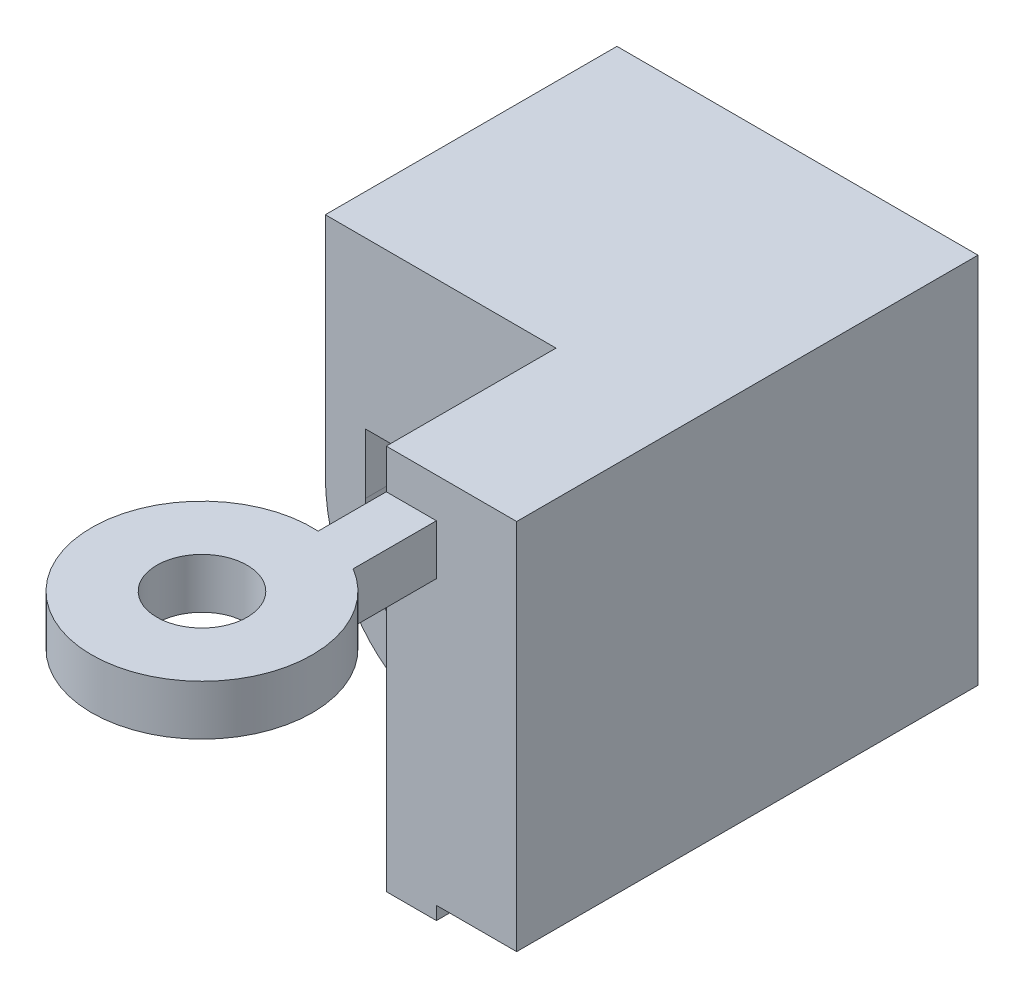
ISO-10303-21;
HEADER;
FILE_DESCRIPTION(('STEP AP214'),'2;1');
FILE_NAME('part.step','',(''),(''),'','','');
FILE_SCHEMA(('AUTOMOTIVE_DESIGN { 1 0 10303 214 1 1 1 1 }'));
ENDSEC;
DATA;
#1=APPLICATION_CONTEXT('core data for automotive mechanical design processes');
#2=APPLICATION_PROTOCOL_DEFINITION('international standard','automotive_design',2000,#1);
#3=PRODUCT_CONTEXT('',#1,'mechanical');
#4=PRODUCT('Part','Part','',(#3));
#5=PRODUCT_RELATED_PRODUCT_CATEGORY('part','',(#4));
#6=PRODUCT_DEFINITION_FORMATION('','',#4);
#7=PRODUCT_DEFINITION_CONTEXT('part definition',#1,'design');
#8=PRODUCT_DEFINITION('design','',#6,#7);
#9=PRODUCT_DEFINITION_SHAPE('','',#8);
#10=(LENGTH_UNIT() NAMED_UNIT(*) SI_UNIT(.MILLI.,.METRE.));
#11=(NAMED_UNIT(*) PLANE_ANGLE_UNIT() SI_UNIT($,.RADIAN.));
#12=(NAMED_UNIT(*) SI_UNIT($,.STERADIAN.) SOLID_ANGLE_UNIT());
#13=UNCERTAINTY_MEASURE_WITH_UNIT(LENGTH_MEASURE(1.E-05),#10,'distance_accuracy_value','');
#14=(GEOMETRIC_REPRESENTATION_CONTEXT(3) GLOBAL_UNCERTAINTY_ASSIGNED_CONTEXT((#13)) GLOBAL_UNIT_ASSIGNED_CONTEXT((#10,
#11,#12)) REPRESENTATION_CONTEXT('',''));
#15=CARTESIAN_POINT('',(0.,0.,0.));
#16=DIRECTION('',(0.,0.,1.));
#17=DIRECTION('',(1.,0.,0.));
#18=AXIS2_PLACEMENT_3D('',#15,#16,#17);
#19=CARTESIAN_POINT('',(-9.37857765787503,-2.33160546492954,46.));
#20=DIRECTION('',(0.,0.,-1.));
#21=DIRECTION('',(-1.,0.,0.));
#22=AXIS2_PLACEMENT_3D('',#19,#20,#21);
#23=CYLINDRICAL_SURFACE('',#22,12.2023172689286);
#24=DIRECTION('',(0.,0.,-1.));
#25=VECTOR('',#24,1.);
#26=CARTESIAN_POINT('',(-9.71845406370081,-14.529188453389,46.));
#27=LINE('',#26,#25);
#28=CARTESIAN_POINT('',(-9.71845406370081,-14.529188453389,29.0788187451511));
#29=VERTEX_POINT('',#28);
#30=CARTESIAN_POINT('',(-9.71845406370081,-14.529188453389,22.0788187451511));
#31=VERTEX_POINT('',#30);
#32=EDGE_CURVE('E549',#29,#31,#27,.T.);
#33=ORIENTED_EDGE('',*,*,#32,.F.);
#34=CARTESIAN_POINT('',(-9.37857765787503,-2.33160546492954,29.0788187451511));
#35=DIRECTION('',(0.,0.,-1.));
#36=DIRECTION('',(-1.,0.,0.));
#37=AXIS2_PLACEMENT_3D('',#34,#35,#36);
#38=CIRCLE('',#37,12.2023172689286);
#39=CARTESIAN_POINT('',(-19.0569817431442,-9.76296073122104,29.0788187451511));
#40=VERTEX_POINT('',#39);
#41=EDGE_CURVE('E312',#29,#40,#38,.T.);
#42=ORIENTED_EDGE('',*,*,#41,.T.);
#43=DIRECTION('',(0.,0.,-1.));
#44=VECTOR('',#43,1.);
#45=CARTESIAN_POINT('',(-19.0569817431442,-9.76296073122104,46.));
#46=LINE('',#45,#44);
#47=CARTESIAN_POINT('',(-19.0569817431442,-9.76296073122104,22.0788187451511));
#48=VERTEX_POINT('',#47);
#49=EDGE_CURVE('E553',#40,#48,#46,.T.);
#50=ORIENTED_EDGE('',*,*,#49,.T.);
#51=CARTESIAN_POINT('',(-9.37857765787503,-2.33160546492954,22.0788187451511));
#52=DIRECTION('',(0.,0.,1.));
#53=DIRECTION('',(1.,0.,0.));
#54=AXIS2_PLACEMENT_3D('',#51,#52,#53);
#55=CIRCLE('',#54,12.2023172689286);
#56=EDGE_CURVE('E424',#48,#31,#55,.T.);
#57=ORIENTED_EDGE('',*,*,#56,.T.);
#58=EDGE_LOOP('',(#33,#42,#50,#57));
#59=FACE_BOUND('',#58,.T.);
#60=ADVANCED_FACE('F47',(#59),#23,.T.);
#61=CARTESIAN_POINT('',(-18.7184559710494,7.4681145556442,46.));
#62=DIRECTION('',(1.,0.,0.));
#63=DIRECTION('',(0.,0.,-1.));
#64=AXIS2_PLACEMENT_3D('',#61,#62,#63);
#65=PLANE('',#64);
#66=DIRECTION('',(0.,1.,0.));
#67=VECTOR('',#66,1.);
#68=CARTESIAN_POINT('',(-18.7184559710494,7.4681145556442,29.0788187451511));
#69=LINE('',#68,#67);
#70=CARTESIAN_POINT('',(-18.7184559710494,1.46885460691373,29.0788187451511));
#71=VERTEX_POINT('',#70);
#72=CARTESIAN_POINT('',(-18.7184559710494,7.4681145556442,29.0788187451511));
#73=VERTEX_POINT('',#72);
#74=EDGE_CURVE('E323',#71,#73,#69,.T.);
#75=ORIENTED_EDGE('',*,*,#74,.F.);
#76=DIRECTION('',(0.,0.,-1.));
#77=VECTOR('',#76,1.);
#78=CARTESIAN_POINT('',(-18.7184559710494,1.46885460691373,46.));
#79=LINE('',#78,#77);
#80=CARTESIAN_POINT('',(-18.7184559710494,1.46885460691373,22.0788187451511));
#81=VERTEX_POINT('',#80);
#82=EDGE_CURVE('E482',#71,#81,#79,.T.);
#83=ORIENTED_EDGE('',*,*,#82,.T.);
#84=DIRECTION('',(0.,-1.,0.));
#85=VECTOR('',#84,1.);
#86=CARTESIAN_POINT('',(-18.7184559710494,7.4681145556442,22.0788187451511));
#87=LINE('',#86,#85);
#88=CARTESIAN_POINT('',(-18.7184559710494,7.4681145556442,22.0788187451511));
#89=VERTEX_POINT('',#88);
#90=EDGE_CURVE('E420',#89,#81,#87,.T.);
#91=ORIENTED_EDGE('',*,*,#90,.F.);
#92=DIRECTION('',(0.,0.,-1.));
#93=VECTOR('',#92,1.);
#94=CARTESIAN_POINT('',(-18.7184559710494,7.4681145556442,46.));
#95=LINE('',#94,#93);
#96=EDGE_CURVE('E462',#73,#89,#95,.T.);
#97=ORIENTED_EDGE('',*,*,#96,.F.);
#98=EDGE_LOOP('',(#75,#83,#91,#97));
#99=FACE_BOUND('',#98,.T.);
#100=ADVANCED_FACE('F622',(#99),#65,.T.);
#101=CARTESIAN_POINT('',(-2.22745247132774,0.798011457426764,46.));
#102=DIRECTION('',(0.,0.,-1.));
#103=DIRECTION('',(-1.,0.,0.));
#104=AXIS2_PLACEMENT_3D('',#101,#102,#103);
#105=CYLINDRICAL_SURFACE('',#104,16.5046425880431);
#106=CARTESIAN_POINT('',(-2.22745247132774,0.798011457426764,29.0788187451511));
#107=DIRECTION('',(0.,0.,-1.));
#108=DIRECTION('',(-1.,0.,0.));
#109=AXIS2_PLACEMENT_3D('',#106,#107,#108);
#110=CIRCLE('',#109,16.5046425880431);
#111=CARTESIAN_POINT('',(-16.1684052355758,-8.03675299806673,29.0788187451511));
#112=VERTEX_POINT('',#111);
#113=EDGE_CURVE('E326',#112,#71,#110,.T.);
#114=ORIENTED_EDGE('',*,*,#113,.F.);
#115=DIRECTION('',(0.,0.,-1.));
#116=VECTOR('',#115,1.);
#117=CARTESIAN_POINT('',(-16.1684052355758,-8.03675299806673,46.));
#118=LINE('',#117,#116);
#119=CARTESIAN_POINT('',(-16.1684052355758,-8.03675299806673,22.0788187451511));
#120=VERTEX_POINT('',#119);
#121=EDGE_CURVE('E478',#112,#120,#118,.T.);
#122=ORIENTED_EDGE('',*,*,#121,.T.);
#123=CARTESIAN_POINT('',(-2.22745247132774,0.798011457426764,22.0788187451511));
#124=DIRECTION('',(0.,0.,1.));
#125=DIRECTION('',(1.,0.,0.));
#126=AXIS2_PLACEMENT_3D('',#123,#124,#125);
#127=CIRCLE('',#126,16.5046425880431);
#128=EDGE_CURVE('E416',#81,#120,#127,.T.);
#129=ORIENTED_EDGE('',*,*,#128,.F.);
#130=ORIENTED_EDGE('',*,*,#82,.F.);
#131=EDGE_LOOP('',(#114,#122,#129,#130));
#132=FACE_BOUND('',#131,.T.);
#133=ADVANCED_FACE('F626',(#132),#105,.F.);
#134=CARTESIAN_POINT('',(-9.81858679943893,-4.01269874818168,46.));
#135=DIRECTION('',(0.,0.,-1.));
#136=DIRECTION('',(-1.,0.,0.));
#137=AXIS2_PLACEMENT_3D('',#134,#135,#136);
#138=CYLINDRICAL_SURFACE('',#137,7.51752663965495);
#139=CARTESIAN_POINT('',(-9.81858679943893,-4.01269874818168,29.0788187451511));
#140=DIRECTION('',(0.,0.,-1.));
#141=DIRECTION('',(-1.,0.,0.));
#142=AXIS2_PLACEMENT_3D('',#139,#140,#141);
#143=CIRCLE('',#142,7.51752663965495);
#144=CARTESIAN_POINT('',(-9.71845406370081,-11.5295584790238,29.0788187451511));
#145=VERTEX_POINT('',#144);
#146=EDGE_CURVE('E329',#145,#112,#143,.T.);
#147=ORIENTED_EDGE('',*,*,#146,.F.);
#148=DIRECTION('',(0.,0.,-1.));
#149=VECTOR('',#148,1.);
#150=CARTESIAN_POINT('',(-9.71845406370081,-11.5295584790238,46.));
#151=LINE('',#150,#149);
#152=CARTESIAN_POINT('',(-9.71845406370081,-11.5295584790238,22.0788187451511));
#153=VERTEX_POINT('',#152);
#154=EDGE_CURVE('E474',#145,#153,#151,.T.);
#155=ORIENTED_EDGE('',*,*,#154,.T.);
#156=CARTESIAN_POINT('',(-9.81858679943893,-4.01269874818168,22.0788187451511));
#157=DIRECTION('',(0.,0.,1.));
#158=DIRECTION('',(1.,0.,0.));
#159=AXIS2_PLACEMENT_3D('',#156,#157,#158);
#160=CIRCLE('',#159,7.51752663965495);
#161=EDGE_CURVE('E412',#120,#153,#160,.T.);
#162=ORIENTED_EDGE('',*,*,#161,.F.);
#163=ORIENTED_EDGE('',*,*,#121,.F.);
#164=EDGE_LOOP('',(#147,#155,#162,#163));
#165=FACE_BOUND('',#164,.T.);
#166=ADVANCED_FACE('F632',(#165),#138,.F.);
#167=CARTESIAN_POINT('',(0.281544028950555,-11.5295584790238,46.));
#168=DIRECTION('',(0.,1.,0.));
#169=DIRECTION('',(0.,0.,1.));
#170=AXIS2_PLACEMENT_3D('',#167,#168,#169);
#171=PLANE('',#170);
#172=DIRECTION('',(-1.,0.,0.));
#173=VECTOR('',#172,1.);
#174=CARTESIAN_POINT('',(0.281544028950555,-11.5295584790238,29.0788187451511));
#175=LINE('',#174,#173);
#176=CARTESIAN_POINT('',(0.281542119193491,-11.5295584790238,29.0788187451511));
#177=VERTEX_POINT('',#176);
#178=EDGE_CURVE('E332',#177,#145,#175,.T.);
#179=ORIENTED_EDGE('',*,*,#178,.F.);
#180=DIRECTION('',(0.,0.,-1.));
#181=VECTOR('',#180,1.);
#182=CARTESIAN_POINT('',(0.281544028950555,-11.5295584790238,46.));
#183=LINE('',#182,#181);
#184=CARTESIAN_POINT('',(0.281544028950555,-11.5295584790238,22.0788187451511));
#185=VERTEX_POINT('',#184);
#186=EDGE_CURVE('E470',#177,#185,#183,.T.);
#187=ORIENTED_EDGE('',*,*,#186,.T.);
#188=DIRECTION('',(1.,0.,0.));
#189=VECTOR('',#188,1.);
#190=CARTESIAN_POINT('',(0.281544028950555,-11.5295584790238,22.0788187451511));
#191=LINE('',#190,#189);
#192=EDGE_CURVE('E408',#153,#185,#191,.T.);
#193=ORIENTED_EDGE('',*,*,#192,.F.);
#194=ORIENTED_EDGE('',*,*,#154,.F.);
#195=EDGE_LOOP('',(#179,#187,#193,#194));
#196=FACE_BOUND('',#195,.T.);
#197=ADVANCED_FACE('F636',(#196),#171,.T.);
#198=CARTESIAN_POINT('',(0.281544028950555,7.4681145556442,46.));
#199=DIRECTION('',(-1.,0.,0.));
#200=DIRECTION('',(0.,0.,1.));
#201=AXIS2_PLACEMENT_3D('',#198,#199,#200);
#202=PLANE('',#201);
#203=ORIENTED_EDGE('',*,*,#186,.F.);
#204=DIRECTION('',(0.,-1.,0.));
#205=VECTOR('',#204,1.);
#206=CARTESIAN_POINT('',(0.281542119193491,37.4681145556442,29.0788187451511));
#207=LINE('',#206,#205);
#208=CARTESIAN_POINT('',(0.281542119193491,-14.529188453389,29.0788187451511));
#209=VERTEX_POINT('',#208);
#210=EDGE_CURVE('E302',#177,#209,#207,.T.);
#211=ORIENTED_EDGE('',*,*,#210,.T.);
#212=DIRECTION('',(0.,0.,-1.));
#213=VECTOR('',#212,1.);
#214=CARTESIAN_POINT('',(0.281542119193491,-14.529188453389,46.));
#215=LINE('',#214,#213);
#216=CARTESIAN_POINT('',(0.281542119193491,-14.529188453389,46.));
#217=VERTEX_POINT('',#216);
#218=EDGE_CURVE('E335',#217,#209,#215,.T.);
#219=ORIENTED_EDGE('',*,*,#218,.F.);
#220=DIRECTION('',(0.,1.,0.));
#221=VECTOR('',#220,1.);
#222=CARTESIAN_POINT('',(0.281544028950555,7.4681145556442,46.));
#223=LINE('',#222,#221);
#224=CARTESIAN_POINT('',(0.281544028950555,15.,46.));
#225=VERTEX_POINT('',#224);
#226=EDGE_CURVE('E433',#217,#225,#223,.T.);
#227=ORIENTED_EDGE('',*,*,#226,.T.);
#228=DIRECTION('',(0.,0.,1.));
#229=VECTOR('',#228,1.);
#230=CARTESIAN_POINT('',(0.281542119193495,15.,46.));
#231=LINE('',#230,#229);
#232=CARTESIAN_POINT('',(0.281542119193495,15.,52.7901615114428));
#233=VERTEX_POINT('',#232);
#234=EDGE_CURVE('E63',#225,#233,#231,.T.);
#235=ORIENTED_EDGE('',*,*,#234,.T.);
#236=DIRECTION('',(0.,1.,0.));
#237=VECTOR('',#236,1.);
#238=CARTESIAN_POINT('',(0.281542119193495,15.,52.7901615114428));
#239=LINE('',#238,#237);
#240=CARTESIAN_POINT('',(0.281542119193495,20.,52.7901615114428));
#241=VERTEX_POINT('',#240);
#242=EDGE_CURVE('E263',#233,#241,#239,.T.);
#243=ORIENTED_EDGE('',*,*,#242,.T.);
#244=DIRECTION('',(0.,0.,1.));
#245=VECTOR('',#244,1.);
#246=CARTESIAN_POINT('',(0.281542119193495,20.,46.));
#247=LINE('',#246,#245);
#248=CARTESIAN_POINT('',(0.281542119193495,20.,46.));
#249=VERTEX_POINT('',#248);
#250=EDGE_CURVE('E293',#249,#241,#247,.T.);
#251=ORIENTED_EDGE('',*,*,#250,.F.);
#252=CARTESIAN_POINT('',(0.281542119193495,23.946100998561,46.));
#253=VERTEX_POINT('',#252);
#254=EDGE_CURVE('E438',#249,#253,#223,.T.);
#255=ORIENTED_EDGE('',*,*,#254,.T.);
#256=DIRECTION('',(0.,0.,1.));
#257=VECTOR('',#256,1.);
#258=CARTESIAN_POINT('',(0.281542119193491,23.946100998561,46.));
#259=LINE('',#258,#257);
#260=CARTESIAN_POINT('',(0.281542119193495,23.946100998561,29.0788187451511));
#261=VERTEX_POINT('',#260);
#262=EDGE_CURVE('E11',#261,#253,#259,.T.);
#263=ORIENTED_EDGE('',*,*,#262,.F.);
#264=CARTESIAN_POINT('',(0.281542119193491,7.4681145556442,29.0788187451511));
#265=VERTEX_POINT('',#264);
#266=EDGE_CURVE('E71',#261,#265,#207,.T.);
#267=ORIENTED_EDGE('',*,*,#266,.T.);
#268=DIRECTION('',(0.,0.,-1.));
#269=VECTOR('',#268,1.);
#270=CARTESIAN_POINT('',(0.281544028950555,7.4681145556442,46.));
#271=LINE('',#270,#269);
#272=CARTESIAN_POINT('',(0.281544028950555,7.4681145556442,22.0788187451511));
#273=VERTEX_POINT('',#272);
#274=EDGE_CURVE('E466',#265,#273,#271,.T.);
#275=ORIENTED_EDGE('',*,*,#274,.T.);
#276=DIRECTION('',(0.,1.,0.));
#277=VECTOR('',#276,1.);
#278=CARTESIAN_POINT('',(0.281544028950555,7.4681145556442,22.0788187451511));
#279=LINE('',#278,#277);
#280=EDGE_CURVE('E404',#185,#273,#279,.T.);
#281=ORIENTED_EDGE('',*,*,#280,.F.);
#282=EDGE_LOOP('',(#203,#211,#219,#227,#235,#243,#251,#255,#263,#267,#275,#281));
#283=FACE_BOUND('',#282,.T.);
#284=ADVANCED_FACE('F608',(#283),#202,.T.);
#285=CARTESIAN_POINT('',(-18.7184559710494,7.4681145556442,46.));
#286=DIRECTION('',(0.,-1.,0.));
#287=DIRECTION('',(0.,0.,-1.));
#288=AXIS2_PLACEMENT_3D('',#285,#286,#287);
#289=PLANE('',#288);
#290=DIRECTION('',(1.,0.,0.));
#291=VECTOR('',#290,1.);
#292=CARTESIAN_POINT('',(-18.7184559710494,7.4681145556442,29.0788187451511));
#293=LINE('',#292,#291);
#294=EDGE_CURVE('E320',#73,#265,#293,.T.);
#295=ORIENTED_EDGE('',*,*,#294,.F.);
#296=ORIENTED_EDGE('',*,*,#96,.T.);
#297=DIRECTION('',(-1.,0.,0.));
#298=VECTOR('',#297,1.);
#299=CARTESIAN_POINT('',(-18.7184559710494,7.4681145556442,22.0788187451511));
#300=LINE('',#299,#298);
#301=EDGE_CURVE('E562',#273,#89,#300,.T.);
#302=ORIENTED_EDGE('',*,*,#301,.F.);
#303=ORIENTED_EDGE('',*,*,#274,.F.);
#304=EDGE_LOOP('',(#295,#296,#302,#303));
#305=FACE_BOUND('',#304,.T.);
#306=ADVANCED_FACE('F613',(#305),#289,.T.);
#307=CARTESIAN_POINT('',(-3.6605392242756,1.46885460691375,46.));
#308=DIRECTION('',(0.,0.,1.));
#309=DIRECTION('',(1.,0.,0.));
#310=AXIS2_PLACEMENT_3D('',#307,#308,#309);
#311=PLANE('',#310);
#312=DIRECTION('',(-1.,0.,0.));
#313=VECTOR('',#312,1.);
#314=CARTESIAN_POINT('',(0.281542119193495,20.,46.));
#315=LINE('',#314,#313);
#316=CARTESIAN_POINT('',(5.28154545946203,20.,46.));
#317=VERTEX_POINT('',#316);
#318=EDGE_CURVE('E266',#317,#249,#315,.T.);
#319=ORIENTED_EDGE('',*,*,#318,.F.);
#320=DIRECTION('',(0.,1.,0.));
#321=VECTOR('',#320,1.);
#322=CARTESIAN_POINT('',(5.28154545946203,15.,46.));
#323=LINE('',#322,#321);
#324=CARTESIAN_POINT('',(5.28154545946203,15.,46.));
#325=VERTEX_POINT('',#324);
#326=EDGE_CURVE('E277',#325,#317,#323,.T.);
#327=ORIENTED_EDGE('',*,*,#326,.F.);
#328=DIRECTION('',(-1.,0.,0.));
#329=VECTOR('',#328,1.);
#330=CARTESIAN_POINT('',(0.281542119193495,15.,46.));
#331=LINE('',#330,#329);
#332=EDGE_CURVE('E281',#325,#225,#331,.T.);
#333=ORIENTED_EDGE('',*,*,#332,.T.);
#334=ORIENTED_EDGE('',*,*,#226,.F.);
#335=DIRECTION('',(1.,0.,0.));
#336=VECTOR('',#335,1.);
#337=CARTESIAN_POINT('',(-9.71845406370081,-14.529188453389,46.));
#338=LINE('',#337,#336);
#339=CARTESIAN_POINT('',(5.28154545946203,-14.529188453389,46.));
#340=VERTEX_POINT('',#339);
#341=EDGE_CURVE('E486',#217,#340,#338,.T.);
#342=ORIENTED_EDGE('',*,*,#341,.T.);
#343=DIRECTION('',(0.,1.,0.));
#344=VECTOR('',#343,1.);
#345=CARTESIAN_POINT('',(5.28154545946203,-14.529188453389,46.));
#346=LINE('',#345,#344);
#347=CARTESIAN_POINT('',(5.28154545946203,-13.2107981828386,46.));
#348=VERTEX_POINT('',#347);
#349=EDGE_CURVE('E489',#340,#348,#346,.T.);
#350=ORIENTED_EDGE('',*,*,#349,.T.);
#351=DIRECTION('',(1.,0.,0.));
#352=VECTOR('',#351,1.);
#353=CARTESIAN_POINT('',(5.28154545946203,-13.2107981828386,46.));
#354=LINE('',#353,#352);
#355=CARTESIAN_POINT('',(13.2815421191935,-13.2107981828386,46.));
#356=VERTEX_POINT('',#355);
#357=EDGE_CURVE('E493',#348,#356,#354,.T.);
#358=ORIENTED_EDGE('',*,*,#357,.T.);
#359=DIRECTION('',(0.,1.,0.));
#360=VECTOR('',#359,1.);
#361=CARTESIAN_POINT('',(13.2815421191935,23.9347969897262,46.));
#362=LINE('',#361,#360);
#363=CARTESIAN_POINT('',(13.2815421191935,23.9347969897262,46.));
#364=VERTEX_POINT('',#363);
#365=EDGE_CURVE('E496',#356,#364,#362,.T.);
#366=ORIENTED_EDGE('',*,*,#365,.T.);
#367=DIRECTION('',(-0.999999621951056,0.00086953881240634,0.));
#368=VECTOR('',#367,1.);
#369=CARTESIAN_POINT('',(-22.7184540637008,23.966100395488,46.));
#370=LINE('',#369,#368);
#371=EDGE_CURVE('E499',#364,#253,#370,.T.);
#372=ORIENTED_EDGE('',*,*,#371,.T.);
#373=ORIENTED_EDGE('',*,*,#254,.F.);
#374=EDGE_LOOP('',(#319,#327,#333,#334,#342,#350,#358,#366,#372,#373));
#375=FACE_BOUND('',#374,.T.);
#376=ADVANCED_FACE('F646',(#375),#311,.T.);
#377=CARTESIAN_POINT('',(-3.6605392242756,1.46885460691375,0.));
#378=DIRECTION('',(0.,0.,1.));
#379=DIRECTION('',(1.,0.,0.));
#380=AXIS2_PLACEMENT_3D('',#377,#378,#379);
#381=PLANE('',#380);
#382=DIRECTION('',(0.,-1.,0.));
#383=VECTOR('',#382,1.);
#384=CARTESIAN_POINT('',(-22.7184540637008,23.966100395488,0.));
#385=LINE('',#384,#383);
#386=CARTESIAN_POINT('',(-22.7184540637008,23.966100395488,0.));
#387=VERTEX_POINT('',#386);
#388=CARTESIAN_POINT('',(-22.7184540637008,1.46885460691374,0.));
#389=VERTEX_POINT('',#388);
#390=EDGE_CURVE('E485',#387,#389,#385,.T.);
#391=ORIENTED_EDGE('',*,*,#390,.F.);
#392=DIRECTION('',(-0.999999621951056,0.00086953881240634,0.));
#393=VECTOR('',#392,1.);
#394=CARTESIAN_POINT('',(-22.7184540637008,23.966100395488,0.));
#395=LINE('',#394,#393);
#396=CARTESIAN_POINT('',(13.2815421191935,23.9347969897262,0.));
#397=VERTEX_POINT('',#396);
#398=EDGE_CURVE('E490',#397,#387,#395,.T.);
#399=ORIENTED_EDGE('',*,*,#398,.F.);
#400=DIRECTION('',(0.,1.,0.));
#401=VECTOR('',#400,1.);
#402=CARTESIAN_POINT('',(13.2815421191935,23.9347969897262,0.));
#403=LINE('',#402,#401);
#404=CARTESIAN_POINT('',(13.2815421191935,-13.2107981828386,0.));
#405=VERTEX_POINT('',#404);
#406=EDGE_CURVE('E524',#405,#397,#403,.T.);
#407=ORIENTED_EDGE('',*,*,#406,.F.);
#408=DIRECTION('',(1.,0.,0.));
#409=VECTOR('',#408,1.);
#410=CARTESIAN_POINT('',(5.28154545946203,-13.2107981828386,0.));
#411=LINE('',#410,#409);
#412=CARTESIAN_POINT('',(5.28154545946203,-13.2107981828386,0.));
#413=VERTEX_POINT('',#412);
#414=EDGE_CURVE('E521',#413,#405,#411,.T.);
#415=ORIENTED_EDGE('',*,*,#414,.F.);
#416=DIRECTION('',(0.,1.,0.));
#417=VECTOR('',#416,1.);
#418=CARTESIAN_POINT('',(5.28154545946203,-14.529188453389,0.));
#419=LINE('',#418,#417);
#420=CARTESIAN_POINT('',(5.28154545946203,-14.529188453389,0.));
#421=VERTEX_POINT('',#420);
#422=EDGE_CURVE('E518',#421,#413,#419,.T.);
#423=ORIENTED_EDGE('',*,*,#422,.F.);
#424=DIRECTION('',(1.,0.,0.));
#425=VECTOR('',#424,1.);
#426=CARTESIAN_POINT('',(-9.71845406370081,-14.529188453389,0.));
#427=LINE('',#426,#425);
#428=CARTESIAN_POINT('',(-9.71845406370081,-14.529188453389,0.));
#429=VERTEX_POINT('',#428);
#430=EDGE_CURVE('E515',#429,#421,#427,.T.);
#431=ORIENTED_EDGE('',*,*,#430,.F.);
#432=CARTESIAN_POINT('',(-9.37857765787503,-2.33160546492954,0.));
#433=DIRECTION('',(0.,0.,1.));
#434=DIRECTION('',(1.,0.,0.));
#435=AXIS2_PLACEMENT_3D('',#432,#433,#434);
#436=CIRCLE('',#435,12.2023172689286);
#437=CARTESIAN_POINT('',(-19.0569817431442,-9.76296073122104,0.));
#438=VERTEX_POINT('',#437);
#439=EDGE_CURVE('E511',#438,#429,#436,.T.);
#440=ORIENTED_EDGE('',*,*,#439,.F.);
#441=CARTESIAN_POINT('',(-3.6605392242756,1.46885460691375,0.));
#442=DIRECTION('',(0.,0.,1.));
#443=DIRECTION('',(1.,0.,0.));
#444=AXIS2_PLACEMENT_3D('',#441,#442,#443);
#445=CIRCLE('',#444,19.0579148394252);
#446=EDGE_CURVE('E507',#389,#438,#445,.T.);
#447=ORIENTED_EDGE('',*,*,#446,.F.);
#448=EDGE_LOOP('',(#391,#399,#407,#415,#423,#431,#440,#447));
#449=FACE_BOUND('',#448,.T.);
#450=DIRECTION('',(0.,-1.,0.));
#451=VECTOR('',#450,1.);
#452=CARTESIAN_POINT('',(-18.7184559710494,7.4681145556442,0.));
#453=LINE('',#452,#451);
#454=CARTESIAN_POINT('',(-18.7184559710494,7.4681145556442,0.));
#455=VERTEX_POINT('',#454);
#456=CARTESIAN_POINT('',(-18.7184559710494,1.46885460691373,0.));
#457=VERTEX_POINT('',#456);
#458=EDGE_CURVE('E432',#455,#457,#453,.T.);
#459=ORIENTED_EDGE('',*,*,#458,.T.);
#460=CARTESIAN_POINT('',(-2.22745247132774,0.798011457426764,0.));
#461=DIRECTION('',(0.,0.,1.));
#462=DIRECTION('',(1.,0.,0.));
#463=AXIS2_PLACEMENT_3D('',#460,#461,#462);
#464=CIRCLE('',#463,16.5046425880431);
#465=CARTESIAN_POINT('',(-16.1684052355758,-8.03675299806673,0.));
#466=VERTEX_POINT('',#465);
#467=EDGE_CURVE('E442',#457,#466,#464,.T.);
#468=ORIENTED_EDGE('',*,*,#467,.T.);
#469=CARTESIAN_POINT('',(-9.81858679943893,-4.01269874818168,0.));
#470=DIRECTION('',(0.,0.,1.));
#471=DIRECTION('',(1.,0.,0.));
#472=AXIS2_PLACEMENT_3D('',#469,#470,#471);
#473=CIRCLE('',#472,7.51752663965495);
#474=CARTESIAN_POINT('',(-9.71845406370081,-11.5295584790238,0.));
#475=VERTEX_POINT('',#474);
#476=EDGE_CURVE('E446',#466,#475,#473,.T.);
#477=ORIENTED_EDGE('',*,*,#476,.T.);
#478=DIRECTION('',(1.,0.,0.));
#479=VECTOR('',#478,1.);
#480=CARTESIAN_POINT('',(0.281544028950555,-11.5295584790238,0.));
#481=LINE('',#480,#479);
#482=CARTESIAN_POINT('',(0.281544028950555,-11.5295584790238,0.));
#483=VERTEX_POINT('',#482);
#484=EDGE_CURVE('E450',#475,#483,#481,.T.);
#485=ORIENTED_EDGE('',*,*,#484,.T.);
#486=DIRECTION('',(0.,1.,0.));
#487=VECTOR('',#486,1.);
#488=CARTESIAN_POINT('',(0.281544028950555,7.4681145556442,0.));
#489=LINE('',#488,#487);
#490=CARTESIAN_POINT('',(0.281544028950555,7.4681145556442,0.));
#491=VERTEX_POINT('',#490);
#492=EDGE_CURVE('E454',#483,#491,#489,.T.);
#493=ORIENTED_EDGE('',*,*,#492,.T.);
#494=DIRECTION('',(-1.,0.,0.));
#495=VECTOR('',#494,1.);
#496=CARTESIAN_POINT('',(-18.7184559710494,7.4681145556442,0.));
#497=LINE('',#496,#495);
#498=EDGE_CURVE('E458',#491,#455,#497,.T.);
#499=ORIENTED_EDGE('',*,*,#498,.T.);
#500=EDGE_LOOP('',(#459,#468,#477,#485,#493,#499));
#501=FACE_BOUND('',#500,.T.);
#502=ADVANCED_FACE('F587',(#449,#501),#381,.F.);
#503=CARTESIAN_POINT('',(-22.7184540637008,23.966100395488,46.));
#504=DIRECTION('',(1.,0.,0.));
#505=DIRECTION('',(0.,0.,-1.));
#506=AXIS2_PLACEMENT_3D('',#503,#504,#505);
#507=PLANE('',#506);
#508=DIRECTION('',(0.,0.,-1.));
#509=VECTOR('',#508,1.);
#510=CARTESIAN_POINT('',(-22.7184540637008,1.46885460691374,46.));
#511=LINE('',#510,#509);
#512=CARTESIAN_POINT('',(-22.7184540637008,1.46885460691375,29.0788187451511));
#513=VERTEX_POINT('',#512);
#514=EDGE_CURVE('E556',#513,#389,#511,.T.);
#515=ORIENTED_EDGE('',*,*,#514,.F.);
#516=DIRECTION('',(0.,-1.,0.));
#517=VECTOR('',#516,1.);
#518=CARTESIAN_POINT('',(-22.7184540637008,37.4681145556442,29.0788187451511));
#519=LINE('',#518,#517);
#520=CARTESIAN_POINT('',(-22.7184540637008,23.966100395488,29.0788187451511));
#521=VERTEX_POINT('',#520);
#522=EDGE_CURVE('E300',#521,#513,#519,.T.);
#523=ORIENTED_EDGE('',*,*,#522,.F.);
#524=DIRECTION('',(0.,0.,-1.));
#525=VECTOR('',#524,1.);
#526=CARTESIAN_POINT('',(-22.7184540637008,23.966100395488,46.));
#527=LINE('',#526,#525);
#528=EDGE_CURVE('E503',#521,#387,#527,.T.);
#529=ORIENTED_EDGE('',*,*,#528,.T.);
#530=ORIENTED_EDGE('',*,*,#390,.T.);
#531=EDGE_LOOP('',(#515,#523,#529,#530));
#532=FACE_BOUND('',#531,.T.);
#533=ADVANCED_FACE('F49',(#532),#507,.F.);
#534=CARTESIAN_POINT('',(-3.6605392242756,1.46885460691375,46.));
#535=DIRECTION('',(0.,0.,-1.));
#536=DIRECTION('',(-1.,0.,0.));
#537=AXIS2_PLACEMENT_3D('',#534,#535,#536);
#538=CYLINDRICAL_SURFACE('',#537,19.0579148394252);
#539=ORIENTED_EDGE('',*,*,#49,.F.);
#540=CARTESIAN_POINT('',(-3.6605392242756,1.46885460691375,29.0788187451511));
#541=DIRECTION('',(0.,0.,-1.));
#542=DIRECTION('',(-1.,0.,0.));
#543=AXIS2_PLACEMENT_3D('',#540,#541,#542);
#544=CIRCLE('',#543,19.0579148394252);
#545=EDGE_CURVE('E316',#40,#513,#544,.T.);
#546=ORIENTED_EDGE('',*,*,#545,.T.);
#547=ORIENTED_EDGE('',*,*,#514,.T.);
#548=ORIENTED_EDGE('',*,*,#446,.T.);
#549=CARTESIAN_POINT('',(-19.0569817431442,-9.76296073122104,7.07881874515108));
#550=VERTEX_POINT('',#549);
#551=EDGE_CURVE('E552',#550,#438,#46,.T.);
#552=ORIENTED_EDGE('',*,*,#551,.F.);
#553=CARTESIAN_POINT('',(-3.6605392242756,1.46885460691375,7.07881874515108));
#554=DIRECTION('',(0.,0.,-1.));
#555=DIRECTION('',(-1.,0.,0.));
#556=AXIS2_PLACEMENT_3D('',#553,#554,#555);
#557=CIRCLE('',#556,19.0579148394252);
#558=CARTESIAN_POINT('',(-22.7030367995896,0.702431668227777,7.07881874515108));
#559=VERTEX_POINT('',#558);
#560=EDGE_CURVE('E400',#550,#559,#557,.T.);
#561=ORIENTED_EDGE('',*,*,#560,.T.);
#562=DIRECTION('',(0.,0.,-1.));
#563=VECTOR('',#562,1.);
#564=CARTESIAN_POINT('',(-22.7030367995896,0.702431668227777,46.));
#565=LINE('',#564,#563);
#566=CARTESIAN_POINT('',(-22.7030367995896,0.702431668227777,22.0788187451511));
#567=VERTEX_POINT('',#566);
#568=EDGE_CURVE('E566',#559,#567,#565,.F.);
#569=ORIENTED_EDGE('',*,*,#568,.T.);
#570=CARTESIAN_POINT('',(-3.6605392242756,1.46885460691375,22.0788187451511));
#571=DIRECTION('',(0.,0.,1.));
#572=DIRECTION('',(1.,0.,0.));
#573=AXIS2_PLACEMENT_3D('',#570,#571,#572);
#574=CIRCLE('',#573,19.0579148394252);
#575=EDGE_CURVE('E428',#567,#48,#574,.T.);
#576=ORIENTED_EDGE('',*,*,#575,.T.);
#577=EDGE_LOOP('',(#539,#546,#547,#548,#552,#561,#569,#576));
#578=FACE_BOUND('',#577,.T.);
#579=ADVANCED_FACE('F583',(#578),#538,.T.);
#580=CARTESIAN_POINT('',(-9.71845406370081,-14.529188453389,7.07881874515108));
#581=VERTEX_POINT('',#580);
#582=EDGE_CURVE('E548',#581,#429,#27,.T.);
#583=ORIENTED_EDGE('',*,*,#582,.F.);
#584=CARTESIAN_POINT('',(-9.37857765787503,-2.33160546492954,7.07881874515108));
#585=DIRECTION('',(0.,0.,-1.));
#586=DIRECTION('',(-1.,0.,0.));
#587=AXIS2_PLACEMENT_3D('',#584,#585,#586);
#588=CIRCLE('',#587,12.2023172689286);
#589=EDGE_CURVE('E396',#581,#550,#588,.T.);
#590=ORIENTED_EDGE('',*,*,#589,.T.);
#591=ORIENTED_EDGE('',*,*,#551,.T.);
#592=ORIENTED_EDGE('',*,*,#439,.T.);
#593=EDGE_LOOP('',(#583,#590,#591,#592));
#594=FACE_BOUND('',#593,.T.);
#595=ADVANCED_FACE('F594',(#594),#23,.T.);
#596=CARTESIAN_POINT('',(-9.71845406370081,-14.529188453389,46.));
#597=DIRECTION('',(0.,1.,0.));
#598=DIRECTION('',(0.,0.,1.));
#599=AXIS2_PLACEMENT_3D('',#596,#597,#598);
#600=PLANE('',#599);
#601=ORIENTED_EDGE('',*,*,#341,.F.);
#602=ORIENTED_EDGE('',*,*,#218,.T.);
#603=DIRECTION('',(-1.,0.,0.));
#604=VECTOR('',#603,1.);
#605=CARTESIAN_POINT('',(-9.71845406370081,-14.529188453389,29.0788187451511));
#606=LINE('',#605,#604);
#607=EDGE_CURVE('E308',#209,#29,#606,.T.);
#608=ORIENTED_EDGE('',*,*,#607,.T.);
#609=ORIENTED_EDGE('',*,*,#32,.T.);
#610=DIRECTION('',(-1.,0.,0.));
#611=VECTOR('',#610,1.);
#612=CARTESIAN_POINT('',(-22.7030367995896,-14.529188453389,22.0788187451511));
#613=LINE('',#612,#611);
#614=CARTESIAN_POINT('',(0.296963200410397,-14.529188453389,22.0788187451511));
#615=VERTEX_POINT('',#614);
#616=EDGE_CURVE('E345',#615,#31,#613,.T.);
#617=ORIENTED_EDGE('',*,*,#616,.F.);
#618=DIRECTION('',(0.,0.,1.));
#619=VECTOR('',#618,1.);
#620=CARTESIAN_POINT('',(0.296963200410397,-14.529188453389,7.07881874515108));
#621=LINE('',#620,#619);
#622=CARTESIAN_POINT('',(0.296963200410397,-14.529188453389,7.07881874515108));
#623=VERTEX_POINT('',#622);
#624=EDGE_CURVE('E360',#623,#615,#621,.T.);
#625=ORIENTED_EDGE('',*,*,#624,.F.);
#626=DIRECTION('',(1.,0.,0.));
#627=VECTOR('',#626,1.);
#628=CARTESIAN_POINT('',(-22.7030367995896,-14.529188453389,7.07881874515108));
#629=LINE('',#628,#627);
#630=EDGE_CURVE('E339',#581,#623,#629,.T.);
#631=ORIENTED_EDGE('',*,*,#630,.F.);
#632=ORIENTED_EDGE('',*,*,#582,.T.);
#633=ORIENTED_EDGE('',*,*,#430,.T.);
#634=DIRECTION('',(0.,0.,-1.));
#635=VECTOR('',#634,1.);
#636=CARTESIAN_POINT('',(5.28154545946203,-14.529188453389,46.));
#637=LINE('',#636,#635);
#638=EDGE_CURVE('E544',#340,#421,#637,.T.);
#639=ORIENTED_EDGE('',*,*,#638,.F.);
#640=EDGE_LOOP('',(#601,#602,#608,#609,#617,#625,#631,#632,#633,#639));
#641=FACE_BOUND('',#640,.T.);
#642=ADVANCED_FACE('F640',(#641),#600,.F.);
#643=CARTESIAN_POINT('',(5.28154545946203,-14.529188453389,46.));
#644=DIRECTION('',(-1.,0.,0.));
#645=DIRECTION('',(0.,0.,1.));
#646=AXIS2_PLACEMENT_3D('',#643,#644,#645);
#647=PLANE('',#646);
#648=ORIENTED_EDGE('',*,*,#422,.T.);
#649=DIRECTION('',(0.,0.,-1.));
#650=VECTOR('',#649,1.);
#651=CARTESIAN_POINT('',(5.28154545946203,-13.2107981828386,46.));
#652=LINE('',#651,#650);
#653=EDGE_CURVE('E540',#348,#413,#652,.T.);
#654=ORIENTED_EDGE('',*,*,#653,.F.);
#655=ORIENTED_EDGE('',*,*,#349,.F.);
#656=ORIENTED_EDGE('',*,*,#638,.T.);
#657=EDGE_LOOP('',(#648,#654,#655,#656));
#658=FACE_BOUND('',#657,.T.);
#659=ADVANCED_FACE('F663',(#658),#647,.F.);
#660=CARTESIAN_POINT('',(5.28154545946203,-13.2107981828386,46.));
#661=DIRECTION('',(0.,1.,0.));
#662=DIRECTION('',(0.,0.,1.));
#663=AXIS2_PLACEMENT_3D('',#660,#661,#662);
#664=PLANE('',#663);
#665=ORIENTED_EDGE('',*,*,#414,.T.);
#666=DIRECTION('',(0.,0.,-1.));
#667=VECTOR('',#666,1.);
#668=CARTESIAN_POINT('',(13.2815421191935,-13.2107981828386,46.));
#669=LINE('',#668,#667);
#670=EDGE_CURVE('E536',#356,#405,#669,.T.);
#671=ORIENTED_EDGE('',*,*,#670,.F.);
#672=ORIENTED_EDGE('',*,*,#357,.F.);
#673=ORIENTED_EDGE('',*,*,#653,.T.);
#674=EDGE_LOOP('',(#665,#671,#672,#673));
#675=FACE_BOUND('',#674,.T.);
#676=ADVANCED_FACE('F661',(#675),#664,.F.);
#677=CARTESIAN_POINT('',(13.2815421191935,23.9347969897262,46.));
#678=DIRECTION('',(-1.,0.,0.));
#679=DIRECTION('',(0.,-1.,0.));
#680=AXIS2_PLACEMENT_3D('',#677,#678,#679);
#681=PLANE('',#680);
#682=ORIENTED_EDGE('',*,*,#406,.T.);
#683=DIRECTION('',(0.,0.,-1.));
#684=VECTOR('',#683,1.);
#685=CARTESIAN_POINT('',(13.2815421191935,23.9347969897262,46.));
#686=LINE('',#685,#684);
#687=EDGE_CURVE('E532',#364,#397,#686,.T.);
#688=ORIENTED_EDGE('',*,*,#687,.F.);
#689=ORIENTED_EDGE('',*,*,#365,.F.);
#690=ORIENTED_EDGE('',*,*,#670,.T.);
#691=EDGE_LOOP('',(#682,#688,#689,#690));
#692=FACE_BOUND('',#691,.T.);
#693=ADVANCED_FACE('F657',(#692),#681,.F.);
#694=CARTESIAN_POINT('',(-22.7184540637008,23.966100395488,46.));
#695=DIRECTION('',(-0.00086953881240634,-0.999999621951055,0.));
#696=DIRECTION('',(0.999999621951056,-0.00086953881240634,0.));
#697=AXIS2_PLACEMENT_3D('',#694,#695,#696);
#698=PLANE('',#697);
#699=DIRECTION('',(0.999999621951056,-0.00086953881240634,0.));
#700=VECTOR('',#699,1.);
#701=CARTESIAN_POINT('',(-22.7184540637008,23.966100395488,29.0788187451511));
#702=LINE('',#701,#700);
#703=EDGE_CURVE('E56',#521,#261,#702,.T.);
#704=ORIENTED_EDGE('',*,*,#703,.T.);
#705=ORIENTED_EDGE('',*,*,#262,.T.);
#706=ORIENTED_EDGE('',*,*,#371,.F.);
#707=ORIENTED_EDGE('',*,*,#687,.T.);
#708=ORIENTED_EDGE('',*,*,#398,.T.);
#709=ORIENTED_EDGE('',*,*,#528,.F.);
#710=EDGE_LOOP('',(#704,#705,#706,#707,#708,#709));
#711=FACE_BOUND('',#710,.T.);
#712=ADVANCED_FACE('F573',(#711),#698,.F.);
#713=DIRECTION('',(0.,1.,0.));
#714=VECTOR('',#713,1.);
#715=CARTESIAN_POINT('',(-18.7184559710494,7.4681145556442,7.07881874515108));
#716=LINE('',#715,#714);
#717=CARTESIAN_POINT('',(-18.7184559710494,1.46885460691373,7.07881874515108));
#718=VERTEX_POINT('',#717);
#719=CARTESIAN_POINT('',(-18.7184559710494,7.4681145556442,7.07881874515108));
#720=VERTEX_POINT('',#719);
#721=EDGE_CURVE('E393',#718,#720,#716,.T.);
#722=ORIENTED_EDGE('',*,*,#721,.F.);
#723=EDGE_CURVE('E481',#718,#457,#79,.T.);
#724=ORIENTED_EDGE('',*,*,#723,.T.);
#725=ORIENTED_EDGE('',*,*,#458,.F.);
#726=EDGE_CURVE('E437',#720,#455,#95,.T.);
#727=ORIENTED_EDGE('',*,*,#726,.F.);
#728=EDGE_LOOP('',(#722,#724,#725,#727));
#729=FACE_BOUND('',#728,.T.);
#730=ADVANCED_FACE('F681',(#729),#65,.T.);
#731=CARTESIAN_POINT('',(-2.22745247132774,0.798011457426764,7.07881874515108));
#732=DIRECTION('',(0.,0.,-1.));
#733=DIRECTION('',(-1.,0.,0.));
#734=AXIS2_PLACEMENT_3D('',#731,#732,#733);
#735=CIRCLE('',#734,16.5046425880431);
#736=CARTESIAN_POINT('',(-16.1684052355758,-8.03675299806673,7.07881874515108));
#737=VERTEX_POINT('',#736);
#738=EDGE_CURVE('E390',#737,#718,#735,.T.);
#739=ORIENTED_EDGE('',*,*,#738,.F.);
#740=EDGE_CURVE('E477',#737,#466,#118,.T.);
#741=ORIENTED_EDGE('',*,*,#740,.T.);
#742=ORIENTED_EDGE('',*,*,#467,.F.);
#743=ORIENTED_EDGE('',*,*,#723,.F.);
#744=EDGE_LOOP('',(#739,#741,#742,#743));
#745=FACE_BOUND('',#744,.T.);
#746=ADVANCED_FACE('F833',(#745),#105,.F.);
#747=CARTESIAN_POINT('',(-9.81858679943893,-4.01269874818168,7.07881874515108));
#748=DIRECTION('',(0.,0.,-1.));
#749=DIRECTION('',(-1.,0.,0.));
#750=AXIS2_PLACEMENT_3D('',#747,#748,#749);
#751=CIRCLE('',#750,7.51752663965495);
#752=CARTESIAN_POINT('',(-9.71845406370081,-11.5295584790238,7.07881874515108));
#753=VERTEX_POINT('',#752);
#754=EDGE_CURVE('E387',#753,#737,#751,.T.);
#755=ORIENTED_EDGE('',*,*,#754,.F.);
#756=EDGE_CURVE('E473',#753,#475,#151,.T.);
#757=ORIENTED_EDGE('',*,*,#756,.T.);
#758=ORIENTED_EDGE('',*,*,#476,.F.);
#759=ORIENTED_EDGE('',*,*,#740,.F.);
#760=EDGE_LOOP('',(#755,#757,#758,#759));
#761=FACE_BOUND('',#760,.T.);
#762=ADVANCED_FACE('F842',(#761),#138,.F.);
#763=DIRECTION('',(-1.,0.,0.));
#764=VECTOR('',#763,1.);
#765=CARTESIAN_POINT('',(0.281544028950555,-11.5295584790238,7.07881874515108));
#766=LINE('',#765,#764);
#767=CARTESIAN_POINT('',(0.281544028950555,-11.5295584790238,7.07881874515108));
#768=VERTEX_POINT('',#767);
#769=EDGE_CURVE('E384',#768,#753,#766,.T.);
#770=ORIENTED_EDGE('',*,*,#769,.F.);
#771=EDGE_CURVE('E469',#768,#483,#183,.T.);
#772=ORIENTED_EDGE('',*,*,#771,.T.);
#773=ORIENTED_EDGE('',*,*,#484,.F.);
#774=ORIENTED_EDGE('',*,*,#756,.F.);
#775=EDGE_LOOP('',(#770,#772,#773,#774));
#776=FACE_BOUND('',#775,.T.);
#777=ADVANCED_FACE('F852',(#776),#171,.T.);
#778=DIRECTION('',(0.,-1.,0.));
#779=VECTOR('',#778,1.);
#780=CARTESIAN_POINT('',(0.281544028950555,7.4681145556442,7.07881874515108));
#781=LINE('',#780,#779);
#782=CARTESIAN_POINT('',(0.281544028950555,7.4681145556442,7.07881874515108));
#783=VERTEX_POINT('',#782);
#784=EDGE_CURVE('E371',#783,#768,#781,.T.);
#785=ORIENTED_EDGE('',*,*,#784,.F.);
#786=EDGE_CURVE('E465',#783,#491,#271,.T.);
#787=ORIENTED_EDGE('',*,*,#786,.T.);
#788=ORIENTED_EDGE('',*,*,#492,.F.);
#789=ORIENTED_EDGE('',*,*,#771,.F.);
#790=EDGE_LOOP('',(#785,#787,#788,#789));
#791=FACE_BOUND('',#790,.T.);
#792=ADVANCED_FACE('F801',(#791),#202,.T.);
#793=DIRECTION('',(1.,0.,0.));
#794=VECTOR('',#793,1.);
#795=CARTESIAN_POINT('',(-18.7184559710494,7.4681145556442,7.07881874515108));
#796=LINE('',#795,#794);
#797=EDGE_CURVE('E559',#720,#783,#796,.T.);
#798=ORIENTED_EDGE('',*,*,#797,.F.);
#799=ORIENTED_EDGE('',*,*,#726,.T.);
#800=ORIENTED_EDGE('',*,*,#498,.F.);
#801=ORIENTED_EDGE('',*,*,#786,.F.);
#802=EDGE_LOOP('',(#798,#799,#800,#801));
#803=FACE_BOUND('',#802,.T.);
#804=ADVANCED_FACE('F871',(#803),#289,.T.);
#805=CARTESIAN_POINT('',(-22.7030367995896,13.470811546611,7.07881874515108));
#806=DIRECTION('',(-1.,0.,0.));
#807=DIRECTION('',(0.,0.,1.));
#808=AXIS2_PLACEMENT_3D('',#805,#806,#807);
#809=PLANE('',#808);
#810=DIRECTION('',(0.,-1.,0.));
#811=VECTOR('',#810,1.);
#812=CARTESIAN_POINT('',(-22.7030367995896,13.470811546611,7.07881874515108));
#813=LINE('',#812,#811);
#814=CARTESIAN_POINT('',(-22.7030367995896,13.470811546611,7.07881874515108));
#815=VERTEX_POINT('',#814);
#816=EDGE_CURVE('E357',#815,#559,#813,.T.);
#817=ORIENTED_EDGE('',*,*,#816,.F.);
#818=DIRECTION('',(0.,0.,-1.));
#819=VECTOR('',#818,1.);
#820=CARTESIAN_POINT('',(-22.7030367995896,13.470811546611,7.07881874515108));
#821=LINE('',#820,#819);
#822=CARTESIAN_POINT('',(-22.7030367995896,13.470811546611,22.0788187451511));
#823=VERTEX_POINT('',#822);
#824=EDGE_CURVE('E340',#823,#815,#821,.T.);
#825=ORIENTED_EDGE('',*,*,#824,.F.);
#826=DIRECTION('',(0.,-1.,0.));
#827=VECTOR('',#826,1.);
#828=CARTESIAN_POINT('',(-22.7030367995896,13.470811546611,22.0788187451511));
#829=LINE('',#828,#827);
#830=EDGE_CURVE('E367',#823,#567,#829,.T.);
#831=ORIENTED_EDGE('',*,*,#830,.T.);
#832=ORIENTED_EDGE('',*,*,#568,.F.);
#833=EDGE_LOOP('',(#817,#825,#831,#832));
#834=FACE_BOUND('',#833,.T.);
#835=ADVANCED_FACE('F880',(#834),#809,.F.);
#836=CARTESIAN_POINT('',(-22.7030367995896,13.470811546611,22.0788187451511));
#837=DIRECTION('',(0.,0.,1.));
#838=DIRECTION('',(1.,0.,0.));
#839=AXIS2_PLACEMENT_3D('',#836,#837,#838);
#840=PLANE('',#839);
#841=ORIENTED_EDGE('',*,*,#90,.T.);
#842=ORIENTED_EDGE('',*,*,#128,.T.);
#843=ORIENTED_EDGE('',*,*,#161,.T.);
#844=ORIENTED_EDGE('',*,*,#192,.T.);
#845=ORIENTED_EDGE('',*,*,#280,.T.);
#846=ORIENTED_EDGE('',*,*,#301,.T.);
#847=EDGE_LOOP('',(#841,#842,#843,#844,#845,#846));
#848=FACE_BOUND('',#847,.T.);
#849=ORIENTED_EDGE('',*,*,#830,.F.);
#850=DIRECTION('',(-1.,0.,0.));
#851=VECTOR('',#850,1.);
#852=CARTESIAN_POINT('',(-22.7030367995896,13.470811546611,22.0788187451511));
#853=LINE('',#852,#851);
#854=CARTESIAN_POINT('',(0.296963200410397,13.470811546611,22.0788187451511));
#855=VERTEX_POINT('',#854);
#856=EDGE_CURVE('E353',#855,#823,#853,.T.);
#857=ORIENTED_EDGE('',*,*,#856,.F.);
#858=DIRECTION('',(0.,-1.,0.));
#859=VECTOR('',#858,1.);
#860=CARTESIAN_POINT('',(0.296963200410397,13.470811546611,22.0788187451511));
#861=LINE('',#860,#859);
#862=EDGE_CURVE('E372',#855,#615,#861,.T.);
#863=ORIENTED_EDGE('',*,*,#862,.T.);
#864=ORIENTED_EDGE('',*,*,#616,.T.);
#865=ORIENTED_EDGE('',*,*,#56,.F.);
#866=ORIENTED_EDGE('',*,*,#575,.F.);
#867=EDGE_LOOP('',(#849,#857,#863,#864,#865,#866));
#868=FACE_BOUND('',#867,.T.);
#869=ADVANCED_FACE('F617',(#848,#868),#840,.F.);
#870=CARTESIAN_POINT('',(-22.7030367995896,13.470811546611,7.07881874515108));
#871=DIRECTION('',(0.,0.,-1.));
#872=DIRECTION('',(-1.,0.,0.));
#873=AXIS2_PLACEMENT_3D('',#870,#871,#872);
#874=PLANE('',#873);
#875=ORIENTED_EDGE('',*,*,#721,.T.);
#876=ORIENTED_EDGE('',*,*,#797,.T.);
#877=ORIENTED_EDGE('',*,*,#784,.T.);
#878=ORIENTED_EDGE('',*,*,#769,.T.);
#879=ORIENTED_EDGE('',*,*,#754,.T.);
#880=ORIENTED_EDGE('',*,*,#738,.T.);
#881=EDGE_LOOP('',(#875,#876,#877,#878,#879,#880));
#882=FACE_BOUND('',#881,.T.);
#883=ORIENTED_EDGE('',*,*,#589,.F.);
#884=ORIENTED_EDGE('',*,*,#630,.T.);
#885=DIRECTION('',(0.,-1.,0.));
#886=VECTOR('',#885,1.);
#887=CARTESIAN_POINT('',(0.296963200410397,13.470811546611,7.07881874515108));
#888=LINE('',#887,#886);
#889=CARTESIAN_POINT('',(0.296963200410397,13.470811546611,7.07881874515108));
#890=VERTEX_POINT('',#889);
#891=EDGE_CURVE('E375',#890,#623,#888,.T.);
#892=ORIENTED_EDGE('',*,*,#891,.F.);
#893=DIRECTION('',(1.,0.,0.));
#894=VECTOR('',#893,1.);
#895=CARTESIAN_POINT('',(-22.7030367995896,13.470811546611,7.07881874515108));
#896=LINE('',#895,#894);
#897=EDGE_CURVE('E344',#815,#890,#896,.T.);
#898=ORIENTED_EDGE('',*,*,#897,.F.);
#899=ORIENTED_EDGE('',*,*,#816,.T.);
#900=ORIENTED_EDGE('',*,*,#560,.F.);
#901=EDGE_LOOP('',(#883,#884,#892,#898,#899,#900));
#902=FACE_BOUND('',#901,.T.);
#903=ADVANCED_FACE('F931',(#882,#902),#874,.F.);
#904=CARTESIAN_POINT('',(0.296963200410397,13.470811546611,7.07881874515108));
#905=DIRECTION('',(1.,0.,0.));
#906=DIRECTION('',(0.,0.,-1.));
#907=AXIS2_PLACEMENT_3D('',#904,#905,#906);
#908=PLANE('',#907);
#909=ORIENTED_EDGE('',*,*,#624,.T.);
#910=ORIENTED_EDGE('',*,*,#862,.F.);
#911=DIRECTION('',(0.,0.,1.));
#912=VECTOR('',#911,1.);
#913=CARTESIAN_POINT('',(0.296963200410397,13.470811546611,7.07881874515108));
#914=LINE('',#913,#912);
#915=EDGE_CURVE('E349',#890,#855,#914,.T.);
#916=ORIENTED_EDGE('',*,*,#915,.F.);
#917=ORIENTED_EDGE('',*,*,#891,.T.);
#918=EDGE_LOOP('',(#909,#910,#916,#917));
#919=FACE_BOUND('',#918,.T.);
#920=ADVANCED_FACE('F939',(#919),#908,.F.);
#921=CARTESIAN_POINT('',(0.,13.470811546611,0.));
#922=DIRECTION('',(0.,1.,0.));
#923=DIRECTION('',(0.,0.,1.));
#924=AXIS2_PLACEMENT_3D('',#921,#922,#923);
#925=PLANE('',#924);
#926=ORIENTED_EDGE('',*,*,#824,.T.);
#927=ORIENTED_EDGE('',*,*,#897,.T.);
#928=ORIENTED_EDGE('',*,*,#915,.T.);
#929=ORIENTED_EDGE('',*,*,#856,.T.);
#930=EDGE_LOOP('',(#926,#927,#928,#929));
#931=FACE_BOUND('',#930,.T.);
#932=ADVANCED_FACE('F811',(#931),#925,.F.);
#933=CARTESIAN_POINT('',(0.281542119193491,37.4681145556442,29.0788187451511));
#934=DIRECTION('',(0.,0.,-1.));
#935=DIRECTION('',(-1.,0.,0.));
#936=AXIS2_PLACEMENT_3D('',#933,#934,#935);
#937=PLANE('',#936);
#938=ORIENTED_EDGE('',*,*,#178,.T.);
#939=ORIENTED_EDGE('',*,*,#146,.T.);
#940=ORIENTED_EDGE('',*,*,#113,.T.);
#941=ORIENTED_EDGE('',*,*,#74,.T.);
#942=ORIENTED_EDGE('',*,*,#294,.T.);
#943=ORIENTED_EDGE('',*,*,#266,.F.);
#944=ORIENTED_EDGE('',*,*,#703,.F.);
#945=ORIENTED_EDGE('',*,*,#522,.T.);
#946=ORIENTED_EDGE('',*,*,#545,.F.);
#947=ORIENTED_EDGE('',*,*,#41,.F.);
#948=ORIENTED_EDGE('',*,*,#607,.F.);
#949=ORIENTED_EDGE('',*,*,#210,.F.);
#950=EDGE_LOOP('',(#938,#939,#940,#941,#942,#943,#944,#945,#946,#947,#948,#949));
#951=FACE_BOUND('',#950,.T.);
#952=ADVANCED_FACE('F576',(#951),#937,.F.);
#953=CARTESIAN_POINT('',(5.28154545946203,15.,46.));
#954=DIRECTION('',(1.,0.,0.));
#955=DIRECTION('',(0.,0.,-1.));
#956=AXIS2_PLACEMENT_3D('',#953,#954,#955);
#957=PLANE('',#956);
#958=DIRECTION('',(0.,0.,-1.));
#959=VECTOR('',#958,1.);
#960=CARTESIAN_POINT('',(5.28154545946203,20.,46.));
#961=LINE('',#960,#959);
#962=CARTESIAN_POINT('',(5.28154545946203,20.,54.3075524478288));
#963=VERTEX_POINT('',#962);
#964=EDGE_CURVE('E275',#963,#317,#961,.T.);
#965=ORIENTED_EDGE('',*,*,#964,.F.);
#966=DIRECTION('',(0.,1.,0.));
#967=VECTOR('',#966,1.);
#968=CARTESIAN_POINT('',(5.28154545946203,15.,54.3075524478288));
#969=LINE('',#968,#967);
#970=CARTESIAN_POINT('',(5.28154545946203,15.,54.3075524478288));
#971=VERTEX_POINT('',#970);
#972=EDGE_CURVE('E260',#971,#963,#969,.T.);
#973=ORIENTED_EDGE('',*,*,#972,.F.);
#974=DIRECTION('',(0.,0.,-1.));
#975=VECTOR('',#974,1.);
#976=CARTESIAN_POINT('',(5.28154545946203,15.,46.));
#977=LINE('',#976,#975);
#978=EDGE_CURVE('E272',#971,#325,#977,.T.);
#979=ORIENTED_EDGE('',*,*,#978,.T.);
#980=ORIENTED_EDGE('',*,*,#326,.T.);
#981=EDGE_LOOP('',(#965,#973,#979,#980));
#982=FACE_BOUND('',#981,.T.);
#983=ADVANCED_FACE('F271',(#982),#957,.T.);
#984=CARTESIAN_POINT('',(-0.321447284179988,15.,63.7736219761336));
#985=DIRECTION('',(0.,-1.,0.));
#986=DIRECTION('',(0.,0.,-1.));
#987=AXIS2_PLACEMENT_3D('',#984,#985,#986);
#988=PLANE('',#987);
#989=ORIENTED_EDGE('',*,*,#332,.F.);
#990=ORIENTED_EDGE('',*,*,#978,.F.);
#991=CARTESIAN_POINT('',(-0.32144728417989,15.,63.7736219761333));
#992=DIRECTION('',(0.,1.,0.));
#993=DIRECTION('',(0.,0.,1.));
#994=AXIS2_PLACEMENT_3D('',#991,#992,#993);
#995=CIRCLE('',#994,11.);
#996=EDGE_CURVE('E257',#233,#971,#995,.T.);
#997=ORIENTED_EDGE('',*,*,#996,.F.);
#998=ORIENTED_EDGE('',*,*,#234,.F.);
#999=EDGE_LOOP('',(#989,#990,#997,#998));
#1000=FACE_BOUND('',#999,.T.);
#1001=CARTESIAN_POINT('',(-0.32144728417989,15.,63.7736219761333));
#1002=DIRECTION('',(0.,1.,0.));
#1003=DIRECTION('',(0.,0.,1.));
#1004=AXIS2_PLACEMENT_3D('',#1001,#1002,#1003);
#1005=CIRCLE('',#1004,4.5);
#1006=CARTESIAN_POINT('',(-0.32144728417989,15.,68.2736219761333));
#1007=VERTEX_POINT('',#1006);
#1008=EDGE_CURVE('E992',#1007,#1007,#1005,.T.);
#1009=ORIENTED_EDGE('',*,*,#1008,.T.);
#1010=EDGE_LOOP('',(#1009));
#1011=FACE_BOUND('',#1010,.T.);
#1012=ADVANCED_FACE('F279',(#1000,#1011),#988,.T.);
#1013=CARTESIAN_POINT('',(-0.321447284179988,20.,63.7736219761336));
#1014=DIRECTION('',(0.,-1.,0.));
#1015=DIRECTION('',(0.,0.,-1.));
#1016=AXIS2_PLACEMENT_3D('',#1013,#1014,#1015);
#1017=PLANE('',#1016);
#1018=ORIENTED_EDGE('',*,*,#318,.T.);
#1019=ORIENTED_EDGE('',*,*,#250,.T.);
#1020=CARTESIAN_POINT('',(-0.32144728417989,20.,63.7736219761333));
#1021=DIRECTION('',(0.,1.,0.));
#1022=DIRECTION('',(0.,0.,1.));
#1023=AXIS2_PLACEMENT_3D('',#1020,#1021,#1022);
#1024=CIRCLE('',#1023,11.);
#1025=EDGE_CURVE('E267',#241,#963,#1024,.T.);
#1026=ORIENTED_EDGE('',*,*,#1025,.T.);
#1027=ORIENTED_EDGE('',*,*,#964,.T.);
#1028=EDGE_LOOP('',(#1018,#1019,#1026,#1027));
#1029=FACE_BOUND('',#1028,.T.);
#1030=CARTESIAN_POINT('',(-0.32144728417989,20.,63.7736219761333));
#1031=DIRECTION('',(0.,1.,0.));
#1032=DIRECTION('',(0.,0.,1.));
#1033=AXIS2_PLACEMENT_3D('',#1030,#1031,#1032);
#1034=CIRCLE('',#1033,4.5);
#1035=CARTESIAN_POINT('',(-0.32144728417989,20.,68.2736219761333));
#1036=VERTEX_POINT('',#1035);
#1037=EDGE_CURVE('E995',#1036,#1036,#1034,.T.);
#1038=ORIENTED_EDGE('',*,*,#1037,.F.);
#1039=EDGE_LOOP('',(#1038));
#1040=FACE_BOUND('',#1039,.T.);
#1041=ADVANCED_FACE('F649',(#1029,#1040),#1017,.F.);
#1042=CARTESIAN_POINT('',(-0.32144728417989,15.,63.7736219761333));
#1043=DIRECTION('',(0.,1.,0.));
#1044=DIRECTION('',(0.,0.,1.));
#1045=AXIS2_PLACEMENT_3D('',#1042,#1043,#1044);
#1046=CYLINDRICAL_SURFACE('',#1045,11.);
#1047=ORIENTED_EDGE('',*,*,#1025,.F.);
#1048=ORIENTED_EDGE('',*,*,#242,.F.);
#1049=ORIENTED_EDGE('',*,*,#996,.T.);
#1050=ORIENTED_EDGE('',*,*,#972,.T.);
#1051=EDGE_LOOP('',(#1047,#1048,#1049,#1050));
#1052=FACE_BOUND('',#1051,.T.);
#1053=ADVANCED_FACE('F259',(#1052),#1046,.T.);
#1054=CARTESIAN_POINT('',(-0.32144728417989,15.,63.7736219761333));
#1055=DIRECTION('',(0.,1.,0.));
#1056=DIRECTION('',(0.,0.,1.));
#1057=AXIS2_PLACEMENT_3D('',#1054,#1055,#1056);
#1058=CYLINDRICAL_SURFACE('',#1057,4.5);
#1059=ORIENTED_EDGE('',*,*,#1008,.F.);
#1060=EDGE_LOOP('',(#1059));
#1061=FACE_BOUND('',#1060,.T.);
#1062=ORIENTED_EDGE('',*,*,#1037,.T.);
#1063=EDGE_LOOP('',(#1062));
#1064=FACE_BOUND('',#1063,.T.);
#1065=ADVANCED_FACE('F775',(#1061,#1064),#1058,.F.);
#1066=CLOSED_SHELL('',(#60,#100,#133,#166,#197,#284,#306,#376,#502,#533,#579,#595,#642,#659,
#676,#693,#712,#730,#746,#762,#777,#792,#804,#835,#869,#903,#920,#932,#952,#983,#1012,#1041,
#1053,#1065));
#1067=MANIFOLD_SOLID_BREP('B2',#1066);
#1068=ADVANCED_BREP_SHAPE_REPRESENTATION('',(#18,#1067),#14);
#1069=SHAPE_DEFINITION_REPRESENTATION(#9,#1068);
ENDSEC;
END-ISO-10303-21;
